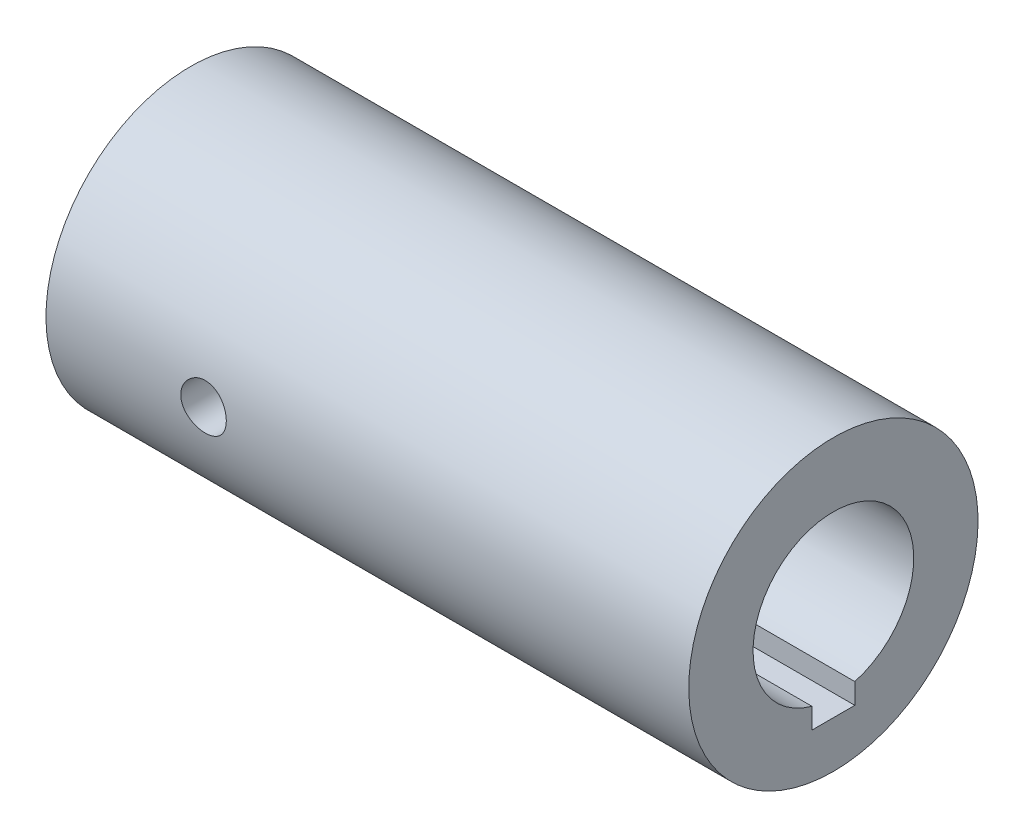
ISO-10303-21;
HEADER;
FILE_DESCRIPTION(('STEP AP214'),'2;1');
FILE_NAME('part.step','',(''),(''),'','','');
FILE_SCHEMA(('AUTOMOTIVE_DESIGN { 1 0 10303 214 1 1 1 1 }'));
ENDSEC;
DATA;
#1=APPLICATION_CONTEXT('core data for automotive mechanical design processes');
#2=APPLICATION_PROTOCOL_DEFINITION('international standard','automotive_design',2000,#1);
#3=PRODUCT_CONTEXT('',#1,'mechanical');
#4=PRODUCT('Part','Part','',(#3));
#5=PRODUCT_RELATED_PRODUCT_CATEGORY('part','',(#4));
#6=PRODUCT_DEFINITION_FORMATION('','',#4);
#7=PRODUCT_DEFINITION_CONTEXT('part definition',#1,'design');
#8=PRODUCT_DEFINITION('design','',#6,#7);
#9=PRODUCT_DEFINITION_SHAPE('','',#8);
#10=(LENGTH_UNIT() NAMED_UNIT(*) SI_UNIT(.MILLI.,.METRE.));
#11=(NAMED_UNIT(*) PLANE_ANGLE_UNIT() SI_UNIT($,.RADIAN.));
#12=(NAMED_UNIT(*) SI_UNIT($,.STERADIAN.) SOLID_ANGLE_UNIT());
#13=UNCERTAINTY_MEASURE_WITH_UNIT(LENGTH_MEASURE(1.E-05),#10,'distance_accuracy_value','');
#14=(GEOMETRIC_REPRESENTATION_CONTEXT(3) GLOBAL_UNCERTAINTY_ASSIGNED_CONTEXT((#13)) GLOBAL_UNIT_ASSIGNED_CONTEXT((#10,
#11,#12)) REPRESENTATION_CONTEXT('',''));
#15=CARTESIAN_POINT('',(0.,0.,0.));
#16=DIRECTION('',(0.,0.,1.));
#17=DIRECTION('',(1.,0.,0.));
#18=AXIS2_PLACEMENT_3D('',#15,#16,#17);
#19=CARTESIAN_POINT('',(-60.,15.,0.));
#20=DIRECTION('',(1.,0.,0.));
#21=DIRECTION('',(0.,1.,0.));
#22=AXIS2_PLACEMENT_3D('',#19,#20,#21);
#23=PLANE('',#22);
#24=DIRECTION('',(0.,0.,1.));
#25=VECTOR('',#24,1.);
#26=CARTESIAN_POINT('',(-60.,-18.3,-4.));
#27=LINE('',#26,#25);
#28=CARTESIAN_POINT('',(-60.,-18.3,-4.));
#29=VERTEX_POINT('',#28);
#30=CARTESIAN_POINT('',(-60.,-18.3,4.));
#31=VERTEX_POINT('',#30);
#32=EDGE_CURVE('E92',#29,#31,#27,.T.);
#33=ORIENTED_EDGE('',*,*,#32,.F.);
#34=DIRECTION('',(0.,1.,0.));
#35=VECTOR('',#34,1.);
#36=CARTESIAN_POINT('',(-60.,-18.3,-4.));
#37=LINE('',#36,#35);
#38=CARTESIAN_POINT('',(-60.,-14.4568322948009,-4.));
#39=VERTEX_POINT('',#38);
#40=EDGE_CURVE('E114',#29,#39,#37,.T.);
#41=ORIENTED_EDGE('',*,*,#40,.T.);
#42=CARTESIAN_POINT('',(-60.,0.,0.));
#43=DIRECTION('',(-1.,0.,0.));
#44=DIRECTION('',(0.,-1.,0.));
#45=AXIS2_PLACEMENT_3D('',#42,#43,#44);
#46=CIRCLE('',#45,15.);
#47=CARTESIAN_POINT('',(-60.,-14.456832294801,4.00000000000001));
#48=VERTEX_POINT('',#47);
#49=EDGE_CURVE('E105',#48,#39,#46,.T.);
#50=ORIENTED_EDGE('',*,*,#49,.F.);
#51=DIRECTION('',(0.,1.,0.));
#52=VECTOR('',#51,1.);
#53=CARTESIAN_POINT('',(-60.,-18.3,4.));
#54=LINE('',#53,#52);
#55=EDGE_CURVE('E62',#31,#48,#54,.T.);
#56=ORIENTED_EDGE('',*,*,#55,.F.);
#57=EDGE_LOOP('',(#33,#41,#50,#56));
#58=FACE_BOUND('',#57,.T.);
#59=CARTESIAN_POINT('',(-60.,0.,0.));
#60=DIRECTION('',(-1.,0.,0.));
#61=DIRECTION('',(0.,-1.,0.));
#62=AXIS2_PLACEMENT_3D('',#59,#60,#61);
#63=CIRCLE('',#62,27.);
#64=CARTESIAN_POINT('',(-60.,-27.,0.));
#65=VERTEX_POINT('',#64);
#66=EDGE_CURVE('E120',#65,#65,#63,.T.);
#67=ORIENTED_EDGE('',*,*,#66,.T.);
#68=EDGE_LOOP('',(#67));
#69=FACE_BOUND('',#68,.T.);
#70=ADVANCED_FACE('F42',(#58,#69),#23,.F.);
#71=CARTESIAN_POINT('',(-60.,0.,0.));
#72=DIRECTION('',(-1.,0.,0.));
#73=DIRECTION('',(0.,-1.,0.));
#74=AXIS2_PLACEMENT_3D('',#71,#72,#73);
#75=CYLINDRICAL_SURFACE('',#74,27.);
#76=CARTESIAN_POINT('',(-26.334904592039,0.,27.));
#77=CARTESIAN_POINT('',(-26.3349142598016,-0.23715285369702,26.9999960750393));
#78=CARTESIAN_POINT('',(-26.3548215566724,-0.474439789620541,26.9968428141752));
#79=CARTESIAN_POINT('',(-26.4338990154312,-0.942371359480702,26.9845673789826));
#80=CARTESIAN_POINT('',(-26.4931064898128,-1.17300946352038,26.9754395323594));
#81=CARTESIAN_POINT('',(-26.6489630863513,-1.62080456875642,26.9522398462363));
#82=CARTESIAN_POINT('',(-26.7455828999265,-1.83797196868977,26.9381718775968));
#83=CARTESIAN_POINT('',(-26.9734476155345,-2.25298112669716,26.9066431258642));
#84=CARTESIAN_POINT('',(-27.1046880769168,-2.45082535881943,26.8891827779735));
#85=CARTESIAN_POINT('',(-27.399265962626,-2.82329811568718,26.8526410138245));
#86=CARTESIAN_POINT('',(-27.5628417065176,-2.99773706212815,26.833548197596));
#87=CARTESIAN_POINT('',(-27.9169339156955,-3.31681106622933,26.7959817461457));
#88=CARTESIAN_POINT('',(-28.1074519930343,-3.4614443392403,26.7775081480556));
#89=CARTESIAN_POINT('',(-28.5113070091752,-3.71754889519365,26.7431612919968));
#90=CARTESIAN_POINT('',(-28.7247627473795,-3.8288349894193,26.7273027674901));
#91=CARTESIAN_POINT('',(-29.1676281743122,-4.01390238565908,26.700138407797));
#92=CARTESIAN_POINT('',(-29.3970369033037,-4.08768594162206,26.6888322990132));
#93=CARTESIAN_POINT('',(-29.8632954093655,-4.19506130753929,26.6721656087048));
#94=CARTESIAN_POINT('',(-30.100068409357,-4.22897889359198,26.666756861936));
#95=CARTESIAN_POINT('',(-30.5760021207348,-4.25666911598487,26.6623513061717));
#96=CARTESIAN_POINT('',(-30.8151626803561,-4.25044428795608,26.6633540921861));
#97=CARTESIAN_POINT('',(-31.2867708711107,-4.19829223282215,26.6716142842267));
#98=CARTESIAN_POINT('',(-31.519259924786,-4.15272918537987,26.6788143164114));
#99=CARTESIAN_POINT('',(-31.9732517073993,-4.0237647660574,26.698568035602));
#100=CARTESIAN_POINT('',(-32.1947540966577,-3.94036222508453,26.7111218880195));
#101=CARTESIAN_POINT('',(-32.621585253802,-3.73771167446049,26.7402315179244));
#102=CARTESIAN_POINT('',(-32.8268401984125,-3.61831071951808,26.7568043105755));
#103=CARTESIAN_POINT('',(-33.2145392801458,-3.34716147317375,26.7920724018515));
#104=CARTESIAN_POINT('',(-33.3969817697544,-3.19541084761888,26.8107678535889));
#105=CARTESIAN_POINT('',(-33.7359866034964,-2.86187725692331,26.8484276561896));
#106=CARTESIAN_POINT('',(-33.8922412509134,-2.67978145918748,26.8673926983003));
#107=CARTESIAN_POINT('',(-34.1720211369645,-2.29178922024805,26.9032636581147));
#108=CARTESIAN_POINT('',(-34.295546204786,-2.08589265483863,26.9201695650719));
#109=CARTESIAN_POINT('',(-34.5063815730427,-1.65586706360369,26.9500377312955));
#110=CARTESIAN_POINT('',(-34.593666647867,-1.43172546730791,26.9629972419227));
#111=CARTESIAN_POINT('',(-34.7292690477105,-0.971715417957423,26.9834898719475));
#112=CARTESIAN_POINT('',(-34.7775892765954,-0.735847840175804,26.9910233957138));
#113=CARTESIAN_POINT('',(-34.8334777587455,-0.261735329887099,26.9997613199618));
#114=CARTESIAN_POINT('',(-34.8414687643796,-0.0235413979410436,27.00103137423));
#115=CARTESIAN_POINT('',(-34.8175962222078,0.450783624065372,26.9972784519158));
#116=CARTESIAN_POINT('',(-34.7857340370719,0.686914784378539,26.9922556904989));
#117=CARTESIAN_POINT('',(-34.6834111507296,1.14911992003457,26.9765221138286));
#118=CARTESIAN_POINT('',(-34.6131578534982,1.3752409407071,26.9658418719435));
#119=CARTESIAN_POINT('',(-34.4362667214058,1.81249513579372,26.9399865580313));
#120=CARTESIAN_POINT('',(-34.3296270305052,2.02362754498749,26.9248112567201));
#121=CARTESIAN_POINT('',(-34.0820086113369,2.42676042454265,26.8914878573971));
#122=CARTESIAN_POINT('',(-33.9407634802608,2.61859535037075,26.8733170724382));
#123=CARTESIAN_POINT('',(-33.6283125865675,2.97598983212627,26.8360919418735));
#124=CARTESIAN_POINT('',(-33.4571048961259,3.14154769605031,26.8170375394727));
#125=CARTESIAN_POINT('',(-33.0877006701551,3.44323920525201,26.7799827559447));
#126=CARTESIAN_POINT('',(-32.8892705800871,3.579088477855,26.7619936697435));
#127=CARTESIAN_POINT('',(-32.4721586989072,3.8155258447596,26.7293110355597));
#128=CARTESIAN_POINT('',(-32.253477497613,3.91611496561222,26.7146173916392));
#129=CARTESIAN_POINT('',(-31.8028960652247,4.07874256663451,26.6902723917565));
#130=CARTESIAN_POINT('',(-31.5710496587843,4.14092718967759,26.6806019433571));
#131=CARTESIAN_POINT('',(-31.1000391152415,4.22544356437585,26.6673487252601));
#132=CARTESIAN_POINT('',(-30.8608755409078,4.24777837311067,26.6637654885829));
#133=CARTESIAN_POINT('',(-30.3848562367991,4.2518829547408,26.6631110134454));
#134=CARTESIAN_POINT('',(-30.148004342645,4.23410005203714,26.6659679646999));
#135=CARTESIAN_POINT('',(-29.6807057232967,4.15943633945809,26.6777153254047));
#136=CARTESIAN_POINT('',(-29.4502589835244,4.10255561857632,26.6866057211217));
#137=CARTESIAN_POINT('',(-29.0024574049637,3.9514748492268,26.7093921936408));
#138=CARTESIAN_POINT('',(-28.7850907072176,3.85730921062861,26.7232836539415));
#139=CARTESIAN_POINT('',(-28.3691684129159,3.63437669339628,26.7545121344657));
#140=CARTESIAN_POINT('',(-28.1706135827802,3.50560840582456,26.7718492949824));
#141=CARTESIAN_POINT('',(-27.7956839329803,3.21551297067001,26.8082452229805));
#142=CARTESIAN_POINT('',(-27.6195662903674,3.05385543965607,26.8273202791406));
#143=CARTESIAN_POINT('',(-27.2968018241968,2.70326839005845,26.8649093745033));
#144=CARTESIAN_POINT('',(-27.1501618364002,2.51433256315032,26.8834232827344));
#145=CARTESIAN_POINT('',(-26.8897077089817,2.11318978067825,26.9179339308913));
#146=CARTESIAN_POINT('',(-26.7760992187004,1.90084792867176,26.9339146307385));
#147=CARTESIAN_POINT('',(-26.5863340653057,1.45993795209869,26.9614016655895));
#148=CARTESIAN_POINT('',(-26.5101392537259,1.23138662870349,26.9729125556715));
#149=CARTESIAN_POINT('',(-26.4143285953811,0.83488990996912,26.9875851726316));
#150=CARTESIAN_POINT('',(-26.3845910461336,0.669371629205708,26.9922164045916));
#151=CARTESIAN_POINT('',(-26.3448757623741,0.335924637167469,26.9984251865002));
#152=CARTESIAN_POINT('',(-26.3348977435232,0.167995960613158,27.0000027803905));
#153=CARTESIAN_POINT('',(-26.334904592039,0.,27.));
#154=B_SPLINE_CURVE_WITH_KNOTS('',3,(#76,#77,#78,#79,#80,#81,#82,#83,#84,#85,#86,#87,#88,#89,
#90,#91,#92,#93,#94,#95,#96,#97,#98,#99,#100,#101,#102,#103,#104,#105,#106,#107,#108,#109,#110,
#111,#112,#113,#114,#115,#116,#117,#118,#119,#120,#121,#122,#123,#124,#125,#126,#127,#128,#129,
#130,#131,#132,#133,#134,#135,#136,#137,#138,#139,#140,#141,#142,#143,#144,#145,#146,#147,#148,
#149,#150,#151,#152,#153),.UNSPECIFIED.,.T.,.F.,(4,2,2,2,2,2,2,2,2,2,2,2,2,2,2,2,2,2,2,2,2,2,2,
2,2,2,2,2,2,2,2,2,2,2,2,2,2,2,4),(0.,0.710844600992774,1.42236506140228,2.13332924538739,
2.8442022811761,3.56052432449003,4.27688924596268,4.99716165361728,5.71739076689074,
6.43169247581055,7.14594906567473,7.85366336314914,8.56139952772264,9.27218604756005,
9.98302387074335,10.7017032475745,11.4203863750489,12.1395689217592,12.8586978662406,
13.5702726281843,14.2818230604551,14.9895668817659,15.6973468098948,16.4107567834997,
17.1242126755869,17.8442248259273,18.5642160123589,19.281450214723,19.9986293920788,
20.7078513819534,21.4170717575175,22.1256391207645,22.8342353395621,23.550336215186,
24.266602960921,24.9872380066255,25.7071367305728,26.2106969374206,26.7142498980062),.UNSPECIFIED.);
#155=CARTESIAN_POINT('',(-26.334904592039,0.,27.));
#156=VERTEX_POINT('',#155);
#157=EDGE_CURVE('E45',#156,#156,#154,.T.);
#158=ORIENTED_EDGE('',*,*,#157,.T.);
#159=EDGE_LOOP('',(#158));
#160=FACE_BOUND('',#159,.T.);
#161=CARTESIAN_POINT('',(-34.834904592039,0.,-27.));
#162=CARTESIAN_POINT('',(-34.8348949242763,-0.23715285369702,-26.9999960750393));
#163=CARTESIAN_POINT('',(-34.8149876274055,-0.47443978962054,-26.9968428141752));
#164=CARTESIAN_POINT('',(-34.7359101686468,-0.942371359480703,-26.9845673789826));
#165=CARTESIAN_POINT('',(-34.6767026942651,-1.17300946352038,-26.9754395323594));
#166=CARTESIAN_POINT('',(-34.5208460977266,-1.62080456875642,-26.9522398462363));
#167=CARTESIAN_POINT('',(-34.4242262841515,-1.83797196868978,-26.9381718775968));
#168=CARTESIAN_POINT('',(-34.1963615685435,-2.25298112669717,-26.9066431258642));
#169=CARTESIAN_POINT('',(-34.0651211071611,-2.45082535881944,-26.8891827779735));
#170=CARTESIAN_POINT('',(-33.7705432214519,-2.82329811568718,-26.8526410138245));
#171=CARTESIAN_POINT('',(-33.6069674775603,-2.99773706212815,-26.833548197596));
#172=CARTESIAN_POINT('',(-33.2528752683824,-3.31681106622933,-26.7959817461457));
#173=CARTESIAN_POINT('',(-33.0623571910436,-3.4614443392403,-26.7775081480556));
#174=CARTESIAN_POINT('',(-32.6585021749027,-3.71754889519365,-26.7431612919968));
#175=CARTESIAN_POINT('',(-32.4450464366984,-3.82883498941931,-26.7273027674901));
#176=CARTESIAN_POINT('',(-32.0021810097658,-4.01390238565909,-26.700138407797));
#177=CARTESIAN_POINT('',(-31.7727722807742,-4.08768594162206,-26.6888322990132));
#178=CARTESIAN_POINT('',(-31.3065137747124,-4.19506130753929,-26.6721656087048));
#179=CARTESIAN_POINT('',(-31.069740774721,-4.22897889359198,-26.666756861936));
#180=CARTESIAN_POINT('',(-30.5938070633431,-4.25666911598487,-26.6623513061717));
#181=CARTESIAN_POINT('',(-30.3546465037218,-4.25044428795608,-26.6633540921861));
#182=CARTESIAN_POINT('',(-29.8830383129672,-4.19829223282215,-26.6716142842267));
#183=CARTESIAN_POINT('',(-29.6505492592919,-4.15272918537987,-26.6788143164114));
#184=CARTESIAN_POINT('',(-29.1965574766786,-4.0237647660574,-26.698568035602));
#185=CARTESIAN_POINT('',(-28.9750550874202,-3.94036222508453,-26.7111218880195));
#186=CARTESIAN_POINT('',(-28.548223930276,-3.73771167446049,-26.7402315179244));
#187=CARTESIAN_POINT('',(-28.3429689856654,-3.61831071951808,-26.7568043105755));
#188=CARTESIAN_POINT('',(-27.9552699039322,-3.34716147317375,-26.7920724018515));
#189=CARTESIAN_POINT('',(-27.7728274143236,-3.19541084761888,-26.8107678535889));
#190=CARTESIAN_POINT('',(-27.4338225805815,-2.86187725692331,-26.8484276561896));
#191=CARTESIAN_POINT('',(-27.2775679331645,-2.67978145918748,-26.8673926983003));
#192=CARTESIAN_POINT('',(-26.9977880471135,-2.29178922024805,-26.9032636581147));
#193=CARTESIAN_POINT('',(-26.8742629792919,-2.08589265483863,-26.9201695650719));
#194=CARTESIAN_POINT('',(-26.6634276110352,-1.65586706360369,-26.9500377312955));
#195=CARTESIAN_POINT('',(-26.5761425362109,-1.43172546730791,-26.9629972419227));
#196=CARTESIAN_POINT('',(-26.4405401363674,-0.971715417957421,-26.9834898719475));
#197=CARTESIAN_POINT('',(-26.3922199074825,-0.735847840175801,-26.9910233957138));
#198=CARTESIAN_POINT('',(-26.3363314253324,-0.261735329887095,-26.9997613199618));
#199=CARTESIAN_POINT('',(-26.3283404196983,-0.0235413979410395,-27.00103137423));
#200=CARTESIAN_POINT('',(-26.3522129618701,0.450783624065377,-26.9972784519158));
#201=CARTESIAN_POINT('',(-26.384075147006,0.686914784378544,-26.9922556904989));
#202=CARTESIAN_POINT('',(-26.4863980333483,1.14911992003457,-26.9765221138286));
#203=CARTESIAN_POINT('',(-26.5566513305797,1.3752409407071,-26.9658418719435));
#204=CARTESIAN_POINT('',(-26.7335424626722,1.81249513579373,-26.9399865580313));
#205=CARTESIAN_POINT('',(-26.8401821535727,2.02362754498749,-26.9248112567201));
#206=CARTESIAN_POINT('',(-27.087800572741,2.42676042454265,-26.8914878573971));
#207=CARTESIAN_POINT('',(-27.2290457038172,2.61859535037076,-26.8733170724382));
#208=CARTESIAN_POINT('',(-27.5414965975104,2.97598983212628,-26.8360919418735));
#209=CARTESIAN_POINT('',(-27.712704287952,3.14154769605032,-26.8170375394727));
#210=CARTESIAN_POINT('',(-28.0821085139229,3.44323920525202,-26.7799827559447));
#211=CARTESIAN_POINT('',(-28.2805386039909,3.57908847785501,-26.7619936697435));
#212=CARTESIAN_POINT('',(-28.6976504851708,3.8155258447596,-26.7293110355597));
#213=CARTESIAN_POINT('',(-28.916331686465,3.91611496561223,-26.7146173916392));
#214=CARTESIAN_POINT('',(-29.3669131188533,4.07874256663451,-26.6902723917565));
#215=CARTESIAN_POINT('',(-29.5987595252937,4.14092718967759,-26.6806019433571));
#216=CARTESIAN_POINT('',(-30.0697700688364,4.22544356437585,-26.6673487252601));
#217=CARTESIAN_POINT('',(-30.3089336431702,4.24777837311067,-26.6637654885829));
#218=CARTESIAN_POINT('',(-30.7849529472788,4.2518829547408,-26.6631110134454));
#219=CARTESIAN_POINT('',(-31.0218048414329,4.23410005203714,-26.6659679646999));
#220=CARTESIAN_POINT('',(-31.4891034607813,4.15943633945809,-26.6777153254047));
#221=CARTESIAN_POINT('',(-31.7195502005535,4.10255561857632,-26.6866057211217));
#222=CARTESIAN_POINT('',(-32.1673517791142,3.95147484922679,-26.7093921936408));
#223=CARTESIAN_POINT('',(-32.3847184768603,3.85730921062861,-26.7232836539415));
#224=CARTESIAN_POINT('',(-32.8006407711621,3.63437669339628,-26.7545121344657));
#225=CARTESIAN_POINT('',(-32.9991956012978,3.50560840582455,-26.7718492949824));
#226=CARTESIAN_POINT('',(-33.3741252510976,3.21551297067,-26.8082452229805));
#227=CARTESIAN_POINT('',(-33.5502428937105,3.05385543965606,-26.8273202791406));
#228=CARTESIAN_POINT('',(-33.8730073598812,2.70326839005844,-26.8649093745033));
#229=CARTESIAN_POINT('',(-34.0196473476778,2.51433256315031,-26.8834232827344));
#230=CARTESIAN_POINT('',(-34.2801014750962,2.11318978067824,-26.9179339308913));
#231=CARTESIAN_POINT('',(-34.3937099653776,1.90084792867176,-26.9339146307385));
#232=CARTESIAN_POINT('',(-34.5834751187723,1.45993795209869,-26.9614016655895));
#233=CARTESIAN_POINT('',(-34.6596699303521,1.23138662870349,-26.9729125556715));
#234=CARTESIAN_POINT('',(-34.7554805886969,0.834889909969122,-26.9875851726316));
#235=CARTESIAN_POINT('',(-34.7852181379443,0.669371629205709,-26.9922164045916));
#236=CARTESIAN_POINT('',(-34.8249334217039,0.335924637167469,-26.9984251865002));
#237=CARTESIAN_POINT('',(-34.8349114405548,0.167995960613158,-27.0000027803905));
#238=CARTESIAN_POINT('',(-34.834904592039,0.,-27.));
#239=B_SPLINE_CURVE_WITH_KNOTS('',3,(#161,#162,#163,#164,#165,#166,#167,#168,#169,#170,#171,
#172,#173,#174,#175,#176,#177,#178,#179,#180,#181,#182,#183,#184,#185,#186,#187,#188,#189,#190,
#191,#192,#193,#194,#195,#196,#197,#198,#199,#200,#201,#202,#203,#204,#205,#206,#207,#208,#209,
#210,#211,#212,#213,#214,#215,#216,#217,#218,#219,#220,#221,#222,#223,#224,#225,#226,#227,#228,
#229,#230,#231,#232,#233,#234,#235,#236,#237,#238),.UNSPECIFIED.,.T.,.F.,(4,2,2,2,2,2,2,2,2,2,2,
2,2,2,2,2,2,2,2,2,2,2,2,2,2,2,2,2,2,2,2,2,2,2,2,2,2,2,4),(0.,0.710844600992774,1.42236506140228,
2.1333292453874,2.84420228117611,3.56052432449003,4.27688924596268,4.99716165361729,
5.71739076689074,6.43169247581055,7.14594906567473,7.85366336314915,8.56139952772264,
9.27218604756005,9.98302387074335,10.7017032475745,11.4203863750489,12.1395689217592,
12.8586978662406,13.5702726281843,14.2818230604551,14.9895668817659,15.6973468098948,
16.4107567834997,17.1242126755869,17.8442248259273,18.5642160123589,19.281450214723,
19.9986293920788,20.7078513819534,21.4170717575175,22.1256391207645,22.8342353395621,
23.550336215186,24.266602960921,24.9872380066255,25.7071367305728,26.2106969374205,
26.7142498980061),.UNSPECIFIED.);
#240=CARTESIAN_POINT('',(-34.834904592039,0.,-27.));
#241=VERTEX_POINT('',#240);
#242=EDGE_CURVE('E123',#241,#241,#239,.T.);
#243=ORIENTED_EDGE('',*,*,#242,.T.);
#244=EDGE_LOOP('',(#243));
#245=FACE_BOUND('',#244,.T.);
#246=ORIENTED_EDGE('',*,*,#66,.F.);
#247=EDGE_LOOP('',(#246));
#248=FACE_BOUND('',#247,.T.);
#249=CARTESIAN_POINT('',(60.,0.,0.));
#250=DIRECTION('',(-1.,0.,0.));
#251=DIRECTION('',(0.,-1.,0.));
#252=AXIS2_PLACEMENT_3D('',#249,#250,#251);
#253=CIRCLE('',#252,27.);
#254=CARTESIAN_POINT('',(60.,-27.,0.));
#255=VERTEX_POINT('',#254);
#256=EDGE_CURVE('E117',#255,#255,#253,.T.);
#257=ORIENTED_EDGE('',*,*,#256,.T.);
#258=EDGE_LOOP('',(#257));
#259=FACE_BOUND('',#258,.T.);
#260=ADVANCED_FACE('F130',(#160,#245,#248,#259),#75,.T.);
#261=CARTESIAN_POINT('',(60.,15.,0.));
#262=DIRECTION('',(-1.,0.,0.));
#263=DIRECTION('',(0.,-1.,0.));
#264=AXIS2_PLACEMENT_3D('',#261,#262,#263);
#265=PLANE('',#264);
#266=CARTESIAN_POINT('',(60.,0.,0.));
#267=DIRECTION('',(-1.,0.,0.));
#268=DIRECTION('',(0.,-1.,0.));
#269=AXIS2_PLACEMENT_3D('',#266,#267,#268);
#270=CIRCLE('',#269,15.);
#271=CARTESIAN_POINT('',(60.,-14.4568322948009,4.));
#272=VERTEX_POINT('',#271);
#273=CARTESIAN_POINT('',(60.,-14.4568322948009,-4.));
#274=VERTEX_POINT('',#273);
#275=EDGE_CURVE('E113',#272,#274,#270,.T.);
#276=ORIENTED_EDGE('',*,*,#275,.T.);
#277=DIRECTION('',(0.,1.,0.));
#278=VECTOR('',#277,1.);
#279=CARTESIAN_POINT('',(60.,-18.3,-4.));
#280=LINE('',#279,#278);
#281=CARTESIAN_POINT('',(60.,-18.3,-4.));
#282=VERTEX_POINT('',#281);
#283=EDGE_CURVE('E107',#282,#274,#280,.T.);
#284=ORIENTED_EDGE('',*,*,#283,.F.);
#285=DIRECTION('',(0.,0.,-1.));
#286=VECTOR('',#285,1.);
#287=CARTESIAN_POINT('',(60.,-18.3,-4.));
#288=LINE('',#287,#286);
#289=CARTESIAN_POINT('',(60.,-18.3,4.));
#290=VERTEX_POINT('',#289);
#291=EDGE_CURVE('E91',#290,#282,#288,.T.);
#292=ORIENTED_EDGE('',*,*,#291,.F.);
#293=DIRECTION('',(0.,1.,0.));
#294=VECTOR('',#293,1.);
#295=CARTESIAN_POINT('',(60.,-18.3,4.));
#296=LINE('',#295,#294);
#297=EDGE_CURVE('E88',#290,#272,#296,.T.);
#298=ORIENTED_EDGE('',*,*,#297,.T.);
#299=EDGE_LOOP('',(#276,#284,#292,#298));
#300=FACE_BOUND('',#299,.T.);
#301=ORIENTED_EDGE('',*,*,#256,.F.);
#302=EDGE_LOOP('',(#301));
#303=FACE_BOUND('',#302,.T.);
#304=ADVANCED_FACE('F157',(#300,#303),#265,.F.);
#305=CARTESIAN_POINT('',(-60.,0.,0.));
#306=DIRECTION('',(-1.,0.,0.));
#307=DIRECTION('',(0.,-1.,0.));
#308=AXIS2_PLACEMENT_3D('',#305,#306,#307);
#309=CYLINDRICAL_SURFACE('',#308,15.);
#310=CARTESIAN_POINT('',(-26.334904592039,0.,15.));
#311=CARTESIAN_POINT('',(-26.3349089105976,0.233735903758502,14.9999971118743));
#312=CARTESIAN_POINT('',(-26.3542509738825,0.467516411306013,14.9944837238696));
#313=CARTESIAN_POINT('',(-26.4309486637448,0.928306924754671,14.9730266378638));
#314=CARTESIAN_POINT('',(-26.488319174368,1.1553142433122,14.9570788559517));
#315=CARTESIAN_POINT('',(-26.6390318563624,1.59584313791903,14.9165070194676));
#316=CARTESIAN_POINT('',(-26.7323243542597,1.80938286468957,14.8918949500168));
#317=CARTESIAN_POINT('',(-26.9520390057754,2.21778745952664,14.8365745564153));
#318=CARTESIAN_POINT('',(-27.0784644682087,2.41265045979084,14.8058656234773));
#319=CARTESIAN_POINT('',(-27.3643095994424,2.78321592605813,14.7407584329945));
#320=CARTESIAN_POINT('',(-27.5244294643142,2.95836609347456,14.7062908802446));
#321=CARTESIAN_POINT('',(-27.8716236564388,3.27972182868294,14.637980436295));
#322=CARTESIAN_POINT('',(-28.05870194164,3.42592313880101,14.6041376376442));
#323=CARTESIAN_POINT('',(-28.4590392470934,3.68802684892063,14.5401881358751));
#324=CARTESIAN_POINT('',(-28.6727416915948,3.80327510921261,14.5101682398622));
#325=CARTESIAN_POINT('',(-29.1174801803458,3.99598059970348,14.4582906499781));
#326=CARTESIAN_POINT('',(-29.3485125531837,4.07344580844342,14.4364312331104));
#327=CARTESIAN_POINT('',(-29.815193096872,4.18643230680051,14.4040683122725));
#328=CARTESIAN_POINT('',(-30.0505773990431,4.22296334331976,14.3932919942674));
#329=CARTESIAN_POINT('',(-30.5243613627009,4.2561951757382,14.3835019688808));
#330=CARTESIAN_POINT('',(-30.7627603701498,4.2529044677125,14.3844857524497));
#331=CARTESIAN_POINT('',(-31.2277678949478,4.20738368353363,14.3978617524435));
#332=CARTESIAN_POINT('',(-31.4545102026951,4.16639600206302,14.4098899528946));
#333=CARTESIAN_POINT('',(-31.8977592321753,4.04864308830224,14.443413720268));
#334=CARTESIAN_POINT('',(-32.1142650404495,3.97187466971385,14.4649101303312));
#335=CARTESIAN_POINT('',(-32.5340361411739,3.78377500309743,14.5152537463671));
#336=CARTESIAN_POINT('',(-32.7371023760967,3.67202420129429,14.5441893769251));
#337=CARTESIAN_POINT('',(-33.1220269639723,3.41742404841451,14.606106050526));
#338=CARTESIAN_POINT('',(-33.3038806512433,3.27456787547111,14.6390879802882));
#339=CARTESIAN_POINT('',(-33.6482919527346,2.95554811005476,14.7068774273018));
#340=CARTESIAN_POINT('',(-33.8098856533624,2.77834701842198,14.7417073201993));
#341=CARTESIAN_POINT('',(-34.1012737976781,2.3989299278313,14.8081793703168));
#342=CARTESIAN_POINT('',(-34.2310666473373,2.19671267569396,14.8398213676957));
#343=CARTESIAN_POINT('',(-34.4556701313933,1.77138523397801,14.896590649469));
#344=CARTESIAN_POINT('',(-34.5502872416874,1.54816768977323,14.9216816743041));
#345=CARTESIAN_POINT('',(-34.7003637884688,1.08811664157791,14.9622605853331));
#346=CARTESIAN_POINT('',(-34.7558329251045,0.851286526271832,14.9777508503029));
#347=CARTESIAN_POINT('',(-34.8244812642909,0.378943696946973,14.9970150902131));
#348=CARTESIAN_POINT('',(-34.8389688966034,0.143635634490966,15.0011514333043));
#349=CARTESIAN_POINT('',(-34.828882603143,-0.326054943364068,14.9982939482367));
#350=CARTESIAN_POINT('',(-34.8043132798899,-0.560437564555484,14.9913014315165));
#351=CARTESIAN_POINT('',(-34.7178769022712,-1.01682344329249,14.9672076487748));
#352=CARTESIAN_POINT('',(-34.6567565580103,-1.23897980984215,14.9503088927647));
#353=CARTESIAN_POINT('',(-34.4998354023541,-1.66985172335221,14.9083364068582));
#354=CARTESIAN_POINT('',(-34.404030609324,-1.8785657239418,14.8832617384328));
#355=CARTESIAN_POINT('',(-34.17814640982,-2.28158177425507,14.826891290685));
#356=CARTESIAN_POINT('',(-34.0473775641253,-2.47547995146874,14.79547389055));
#357=CARTESIAN_POINT('',(-33.7561295323003,-2.83903338637667,14.7300396191885));
#358=CARTESIAN_POINT('',(-33.5956437009559,-3.00868320666891,14.6960221675481));
#359=CARTESIAN_POINT('',(-33.2433869369712,-3.32456107574155,14.6278596672057));
#360=CARTESIAN_POINT('',(-33.0507765683565,-3.46986157633098,14.5937456285391));
#361=CARTESIAN_POINT('',(-32.6431725577956,-3.72612048210724,14.5304340548377));
#362=CARTESIAN_POINT('',(-32.4281797202205,-3.83708012085165,14.5012363432208));
#363=CARTESIAN_POINT('',(-31.9828335935978,-4.02069295537116,14.4514043291436));
#364=CARTESIAN_POINT('',(-31.7525707352427,-4.09355231762717,14.4307240695142));
#365=CARTESIAN_POINT('',(-31.2823632864386,-4.19929456159121,14.4003128629765));
#366=CARTESIAN_POINT('',(-31.0424215908722,-4.23218930621465,14.3905786669523));
#367=CARTESIAN_POINT('',(-30.569229555111,-4.25632379292053,14.3834573170053));
#368=CARTESIAN_POINT('',(-30.3360613760182,-4.24906419600604,14.3856253268564));
#369=CARTESIAN_POINT('',(-29.8744188610315,-4.19662630102083,14.4010089333252));
#370=CARTESIAN_POINT('',(-29.6459443735901,-4.15144922918745,14.4142241726793));
#371=CARTESIAN_POINT('',(-29.2023371144906,-4.02537863704035,14.4499315838925));
#372=CARTESIAN_POINT('',(-28.9870949990678,-3.94484170053666,14.4723309932438));
#373=CARTESIAN_POINT('',(-28.5730088579159,-3.7506132866242,14.5238751821933));
#374=CARTESIAN_POINT('',(-28.3741677016798,-3.63691602323986,14.5530211387785));
#375=CARTESIAN_POINT('',(-27.9914607937505,-3.37520947877457,14.6159711575891));
#376=CARTESIAN_POINT('',(-27.8083025008836,-3.22619483896407,14.649896878713));
#377=CARTESIAN_POINT('',(-27.4691044032441,-2.89994549393589,14.7179495625547));
#378=CARTESIAN_POINT('',(-27.3130714054481,-2.72270372656126,14.7520765735701));
#379=CARTESIAN_POINT('',(-27.0286770111493,-2.33966929175797,14.8177120621263));
#380=CARTESIAN_POINT('',(-26.9011081335425,-2.13327184941117,14.8491333556775));
#381=CARTESIAN_POINT('',(-26.6826730356117,-1.7010702096589,14.9048213589026));
#382=CARTESIAN_POINT('',(-26.5917863009306,-1.47527694523231,14.9290920654601));
#383=CARTESIAN_POINT('',(-26.4593698855994,-1.04237100834652,14.9650951924588));
#384=CARTESIAN_POINT('',(-26.4128123178352,-0.836887756992193,14.9780830337421));
#385=CARTESIAN_POINT('',(-26.3505797163036,-0.420947965371014,14.9955361888554));
#386=CARTESIAN_POINT('',(-26.3349007029388,-0.210492069512138,15.0000026009164));
#387=CARTESIAN_POINT('',(-26.334904592039,0.,15.));
#388=B_SPLINE_CURVE_WITH_KNOTS('',3,(#310,#311,#312,#313,#314,#315,#316,#317,#318,#319,#320,
#321,#322,#323,#324,#325,#326,#327,#328,#329,#330,#331,#332,#333,#334,#335,#336,#337,#338,#339,
#340,#341,#342,#343,#344,#345,#346,#347,#348,#349,#350,#351,#352,#353,#354,#355,#356,#357,#358,
#359,#360,#361,#362,#363,#364,#365,#366,#367,#368,#369,#370,#371,#372,#373,#374,#375,#376,#377,
#378,#379,#380,#381,#382,#383,#384,#385,#386,#387),.UNSPECIFIED.,.T.,.F.,(4,2,2,2,2,2,2,2,2,2,2,
2,2,2,2,2,2,2,2,2,2,2,2,2,2,2,2,2,2,2,2,2,2,2,2,2,2,2,4),(0.,0.700435177756152,1.40114466252869,
2.10088865525112,2.80070255437281,3.51682382624258,4.23305034405468,4.9633966915684,
5.69358874704828,6.40534245751004,7.11694431610235,7.80590278350416,8.49492261483684,
9.19254492512223,9.89032038865505,10.613934870117,11.3375856155885,12.0651606888393,
12.7925554190042,13.4964489984299,14.2002596363149,14.8901608856646,15.5801413580196,
16.2848836911468,16.9897838071603,17.7173297125852,18.4448494808106,19.1683906916762,
19.8917170773427,20.5881981475602,21.2846566947008,21.974247636784,22.6639589741166,
23.376350514924,24.0889205700846,24.8193692966279,25.5494089544089,26.1802707640797,
26.8110512635845),.UNSPECIFIED.);
#389=CARTESIAN_POINT('',(-26.334904592039,0.,15.));
#390=VERTEX_POINT('',#389);
#391=EDGE_CURVE('E129',#390,#390,#388,.T.);
#392=ORIENTED_EDGE('',*,*,#391,.T.);
#393=EDGE_LOOP('',(#392));
#394=FACE_BOUND('',#393,.T.);
#395=CARTESIAN_POINT('',(-34.834904592039,0.,-15.));
#396=CARTESIAN_POINT('',(-34.8349002734804,0.233735903758503,-14.9999971118743));
#397=CARTESIAN_POINT('',(-34.8155582101954,0.467516411306014,-14.9944837238696));
#398=CARTESIAN_POINT('',(-34.7388605203331,0.928306924754673,-14.9730266378638));
#399=CARTESIAN_POINT('',(-34.6814900097099,1.1553142433122,-14.9570788559517));
#400=CARTESIAN_POINT('',(-34.5307773277156,1.59584313791903,-14.9165070194676));
#401=CARTESIAN_POINT('',(-34.4374848298182,1.80938286468957,-14.8918949500168));
#402=CARTESIAN_POINT('',(-34.2177701783026,2.21778745952664,-14.8365745564153));
#403=CARTESIAN_POINT('',(-34.0913447158693,2.41265045979084,-14.8058656234773));
#404=CARTESIAN_POINT('',(-33.8054995846356,2.78321592605813,-14.7407584329945));
#405=CARTESIAN_POINT('',(-33.6453797197637,2.95836609347456,-14.7062908802446));
#406=CARTESIAN_POINT('',(-33.2981855276391,3.27972182868294,-14.637980436295));
#407=CARTESIAN_POINT('',(-33.1111072424379,3.42592313880101,-14.6041376376442));
#408=CARTESIAN_POINT('',(-32.7107699369845,3.68802684892063,-14.5401881358751));
#409=CARTESIAN_POINT('',(-32.4970674924831,3.80327510921261,-14.5101682398622));
#410=CARTESIAN_POINT('',(-32.0523290037322,3.99598059970348,-14.4582906499781));
#411=CARTESIAN_POINT('',(-31.8212966308943,4.07344580844342,-14.4364312331104));
#412=CARTESIAN_POINT('',(-31.354616087206,4.18643230680051,-14.4040683122725));
#413=CARTESIAN_POINT('',(-31.1192317850348,4.22296334331976,-14.3932919942674));
#414=CARTESIAN_POINT('',(-30.645447821377,4.2561951757382,-14.3835019688808));
#415=CARTESIAN_POINT('',(-30.4070488139281,4.2529044677125,-14.3844857524497));
#416=CARTESIAN_POINT('',(-29.9420412891301,4.20738368353363,-14.3978617524435));
#417=CARTESIAN_POINT('',(-29.7152989813828,4.16639600206302,-14.4098899528946));
#418=CARTESIAN_POINT('',(-29.2720499519027,4.04864308830223,-14.443413720268));
#419=CARTESIAN_POINT('',(-29.0555441436285,3.97187466971384,-14.4649101303312));
#420=CARTESIAN_POINT('',(-28.635773042904,3.78377500309743,-14.5152537463671));
#421=CARTESIAN_POINT('',(-28.4327068079812,3.67202420129429,-14.5441893769251));
#422=CARTESIAN_POINT('',(-28.0477822201057,3.41742404841451,-14.6061060505261));
#423=CARTESIAN_POINT('',(-27.8659285328346,3.27456787547111,-14.6390879802883));
#424=CARTESIAN_POINT('',(-27.5215172313433,2.95554811005475,-14.7068774273018));
#425=CARTESIAN_POINT('',(-27.3599235307155,2.77834701842198,-14.7417073201993));
#426=CARTESIAN_POINT('',(-27.0685353863998,2.3989299278313,-14.8081793703168));
#427=CARTESIAN_POINT('',(-26.9387425367406,2.19671267569395,-14.8398213676957));
#428=CARTESIAN_POINT('',(-26.7141390526846,1.77138523397801,-14.896590649469));
#429=CARTESIAN_POINT('',(-26.6195219423905,1.54816768977322,-14.9216816743041));
#430=CARTESIAN_POINT('',(-26.4694453956091,1.0881166415779,-14.9622605853331));
#431=CARTESIAN_POINT('',(-26.4139762589734,0.85128652627183,-14.9777508503029));
#432=CARTESIAN_POINT('',(-26.3453279197871,0.378943696946971,-14.9970150902131));
#433=CARTESIAN_POINT('',(-26.3308402874745,0.143635634490964,-15.0011514333043));
#434=CARTESIAN_POINT('',(-26.340926580935,-0.326054943364069,-14.9982939482367));
#435=CARTESIAN_POINT('',(-26.365495904188,-0.560437564555486,-14.9913014315165));
#436=CARTESIAN_POINT('',(-26.4519322818068,-1.0168234432925,-14.9672076487748));
#437=CARTESIAN_POINT('',(-26.5130526260677,-1.23897980984216,-14.9503088927647));
#438=CARTESIAN_POINT('',(-26.6699737817239,-1.66985172335222,-14.9083364068582));
#439=CARTESIAN_POINT('',(-26.7657785747539,-1.8785657239418,-14.8832617384328));
#440=CARTESIAN_POINT('',(-26.991662774258,-2.28158177425507,-14.826891290685));
#441=CARTESIAN_POINT('',(-27.1224316199527,-2.47547995146874,-14.79547389055));
#442=CARTESIAN_POINT('',(-27.4136796517776,-2.83903338637667,-14.7300396191885));
#443=CARTESIAN_POINT('',(-27.574165483122,-3.00868320666891,-14.6960221675481));
#444=CARTESIAN_POINT('',(-27.9264222471067,-3.32456107574155,-14.6278596672057));
#445=CARTESIAN_POINT('',(-28.1190326157214,-3.46986157633098,-14.5937456285391));
#446=CARTESIAN_POINT('',(-28.5266366262824,-3.72612048210724,-14.5304340548377));
#447=CARTESIAN_POINT('',(-28.7416294638574,-3.83708012085165,-14.5012363432208));
#448=CARTESIAN_POINT('',(-29.1869755904801,-4.02069295537116,-14.4514043291436));
#449=CARTESIAN_POINT('',(-29.4172384488352,-4.09355231762717,-14.4307240695142));
#450=CARTESIAN_POINT('',(-29.8874458976394,-4.19929456159121,-14.4003128629765));
#451=CARTESIAN_POINT('',(-30.1273875932057,-4.23218930621465,-14.3905786669523));
#452=CARTESIAN_POINT('',(-30.600579628967,-4.25632379292053,-14.3834573170053));
#453=CARTESIAN_POINT('',(-30.8337478080598,-4.24906419600604,-14.3856253268564));
#454=CARTESIAN_POINT('',(-31.2953903230464,-4.19662630102083,-14.4010089333252));
#455=CARTESIAN_POINT('',(-31.5238648104878,-4.15144922918745,-14.4142241726793));
#456=CARTESIAN_POINT('',(-31.9674720695873,-4.02537863704035,-14.4499315838925));
#457=CARTESIAN_POINT('',(-32.1827141850101,-3.94484170053665,-14.4723309932438));
#458=CARTESIAN_POINT('',(-32.596800326162,-3.7506132866242,-14.5238751821933));
#459=CARTESIAN_POINT('',(-32.7956414823982,-3.63691602323986,-14.5530211387785));
#460=CARTESIAN_POINT('',(-33.1783483903275,-3.37520947877456,-14.6159711575891));
#461=CARTESIAN_POINT('',(-33.3615066831943,-3.22619483896407,-14.649896878713));
#462=CARTESIAN_POINT('',(-33.7007047808338,-2.89994549393588,-14.7179495625547));
#463=CARTESIAN_POINT('',(-33.8567377786299,-2.72270372656126,-14.7520765735702));
#464=CARTESIAN_POINT('',(-34.1411321729286,-2.33966929175797,-14.8177120621263));
#465=CARTESIAN_POINT('',(-34.2687010505354,-2.13327184941117,-14.8491333556775));
#466=CARTESIAN_POINT('',(-34.4871361484662,-1.7010702096589,-14.9048213589026));
#467=CARTESIAN_POINT('',(-34.5780228831474,-1.47527694523231,-14.9290920654601));
#468=CARTESIAN_POINT('',(-34.7104392984786,-1.04237100834652,-14.9650951924588));
#469=CARTESIAN_POINT('',(-34.7569968662428,-0.836887756992193,-14.9780830337421));
#470=CARTESIAN_POINT('',(-34.8192294677743,-0.420947965371014,-14.9955361888554));
#471=CARTESIAN_POINT('',(-34.8349084811391,-0.210492069512138,-15.0000026009164));
#472=CARTESIAN_POINT('',(-34.834904592039,0.,-15.));
#473=B_SPLINE_CURVE_WITH_KNOTS('',3,(#395,#396,#397,#398,#399,#400,#401,#402,#403,#404,#405,
#406,#407,#408,#409,#410,#411,#412,#413,#414,#415,#416,#417,#418,#419,#420,#421,#422,#423,#424,
#425,#426,#427,#428,#429,#430,#431,#432,#433,#434,#435,#436,#437,#438,#439,#440,#441,#442,#443,
#444,#445,#446,#447,#448,#449,#450,#451,#452,#453,#454,#455,#456,#457,#458,#459,#460,#461,#462,
#463,#464,#465,#466,#467,#468,#469,#470,#471,#472),.UNSPECIFIED.,.T.,.F.,(4,2,2,2,2,2,2,2,2,2,2,
2,2,2,2,2,2,2,2,2,2,2,2,2,2,2,2,2,2,2,2,2,2,2,2,2,2,2,4),(0.,0.700435177756154,1.40114466252869,
2.10088865525112,2.80070255437281,3.51682382624258,4.23305034405468,4.96339669156839,
5.69358874704829,6.40534245751004,7.11694431610235,7.80590278350417,8.49492261483684,
9.19254492512223,9.89032038865505,10.613934870117,11.3375856155885,12.0651606888393,
12.7925554190042,13.4964489984299,14.2002596363149,14.8901608856646,15.5801413580196,
16.2848836911468,16.9897838071603,17.7173297125852,18.4448494808106,19.1683906916762,
19.8917170773427,20.5881981475602,21.2846566947008,21.974247636784,22.6639589741166,
23.376350514924,24.0889205700846,24.8193692966279,25.5494089544089,26.1802707640797,
26.8110512635845),.UNSPECIFIED.);
#474=CARTESIAN_POINT('',(-34.834904592039,0.,-15.));
#475=VERTEX_POINT('',#474);
#476=EDGE_CURVE('E100',#475,#475,#473,.T.);
#477=ORIENTED_EDGE('',*,*,#476,.T.);
#478=EDGE_LOOP('',(#477));
#479=FACE_BOUND('',#478,.T.);
#480=ORIENTED_EDGE('',*,*,#49,.T.);
#481=DIRECTION('',(-1.,0.,0.));
#482=VECTOR('',#481,1.);
#483=CARTESIAN_POINT('',(-60.,-14.4568322948009,-4.));
#484=LINE('',#483,#482);
#485=EDGE_CURVE('E11',#39,#274,#484,.F.);
#486=ORIENTED_EDGE('',*,*,#485,.T.);
#487=ORIENTED_EDGE('',*,*,#275,.F.);
#488=DIRECTION('',(-1.,0.,0.));
#489=VECTOR('',#488,1.);
#490=CARTESIAN_POINT('',(-60.,-14.4568322948009,4.));
#491=LINE('',#490,#489);
#492=EDGE_CURVE('E54',#272,#48,#491,.T.);
#493=ORIENTED_EDGE('',*,*,#492,.T.);
#494=EDGE_LOOP('',(#480,#486,#487,#493));
#495=FACE_BOUND('',#494,.T.);
#496=ADVANCED_FACE('F152',(#394,#479,#495),#309,.F.);
#497=CARTESIAN_POINT('',(-60.,-18.3,-4.));
#498=DIRECTION('',(0.,0.,-1.));
#499=DIRECTION('',(-1.,0.,0.));
#500=AXIS2_PLACEMENT_3D('',#497,#498,#499);
#501=PLANE('',#500);
#502=ORIENTED_EDGE('',*,*,#40,.F.);
#503=DIRECTION('',(-1.,0.,0.));
#504=VECTOR('',#503,1.);
#505=CARTESIAN_POINT('',(-60.,-18.3,-4.));
#506=LINE('',#505,#504);
#507=EDGE_CURVE('E98',#282,#29,#506,.T.);
#508=ORIENTED_EDGE('',*,*,#507,.F.);
#509=ORIENTED_EDGE('',*,*,#283,.T.);
#510=ORIENTED_EDGE('',*,*,#485,.F.);
#511=EDGE_LOOP('',(#502,#508,#509,#510));
#512=FACE_BOUND('',#511,.T.);
#513=ADVANCED_FACE('F156',(#512),#501,.F.);
#514=CARTESIAN_POINT('',(-60.,-18.3,4.));
#515=DIRECTION('',(0.,0.,1.));
#516=DIRECTION('',(1.,0.,0.));
#517=AXIS2_PLACEMENT_3D('',#514,#515,#516);
#518=PLANE('',#517);
#519=ORIENTED_EDGE('',*,*,#297,.F.);
#520=DIRECTION('',(1.,0.,0.));
#521=VECTOR('',#520,1.);
#522=CARTESIAN_POINT('',(-60.,-18.3,4.));
#523=LINE('',#522,#521);
#524=EDGE_CURVE('E84',#31,#290,#523,.T.);
#525=ORIENTED_EDGE('',*,*,#524,.F.);
#526=ORIENTED_EDGE('',*,*,#55,.T.);
#527=ORIENTED_EDGE('',*,*,#492,.F.);
#528=EDGE_LOOP('',(#519,#525,#526,#527));
#529=FACE_BOUND('',#528,.T.);
#530=ADVANCED_FACE('F86',(#529),#518,.F.);
#531=CARTESIAN_POINT('',(0.,-18.3,0.));
#532=DIRECTION('',(0.,1.,0.));
#533=DIRECTION('',(0.,0.,1.));
#534=AXIS2_PLACEMENT_3D('',#531,#532,#533);
#535=PLANE('',#534);
#536=ORIENTED_EDGE('',*,*,#32,.T.);
#537=ORIENTED_EDGE('',*,*,#524,.T.);
#538=ORIENTED_EDGE('',*,*,#291,.T.);
#539=ORIENTED_EDGE('',*,*,#507,.T.);
#540=EDGE_LOOP('',(#536,#537,#538,#539));
#541=FACE_BOUND('',#540,.T.);
#542=ADVANCED_FACE('F96',(#541),#535,.T.);
#543=CARTESIAN_POINT('',(-30.584904592039,0.,-30.));
#544=DIRECTION('',(0.,0.,-1.));
#545=DIRECTION('',(-1.,0.,0.));
#546=AXIS2_PLACEMENT_3D('',#543,#544,#545);
#547=CYLINDRICAL_SURFACE('',#546,4.24999999999999);
#548=ORIENTED_EDGE('',*,*,#242,.F.);
#549=EDGE_LOOP('',(#548));
#550=FACE_BOUND('',#549,.T.);
#551=ORIENTED_EDGE('',*,*,#476,.F.);
#552=EDGE_LOOP('',(#551));
#553=FACE_BOUND('',#552,.T.);
#554=ADVANCED_FACE('F133',(#550,#553),#547,.F.);
#555=CARTESIAN_POINT('',(-30.584904592039,0.,30.));
#556=DIRECTION('',(0.,0.,1.));
#557=DIRECTION('',(1.,0.,0.));
#558=AXIS2_PLACEMENT_3D('',#555,#556,#557);
#559=CYLINDRICAL_SURFACE('',#558,4.24999999999999);
#560=ORIENTED_EDGE('',*,*,#157,.F.);
#561=EDGE_LOOP('',(#560));
#562=FACE_BOUND('',#561,.T.);
#563=ORIENTED_EDGE('',*,*,#391,.F.);
#564=EDGE_LOOP('',(#563));
#565=FACE_BOUND('',#564,.T.);
#566=ADVANCED_FACE('F137',(#562,#565),#559,.F.);
#567=CLOSED_SHELL('',(#70,#260,#304,#496,#513,#530,#542,#554,#566));
#568=MANIFOLD_SOLID_BREP('B2',#567);
#569=ADVANCED_BREP_SHAPE_REPRESENTATION('',(#18,#568),#14);
#570=SHAPE_DEFINITION_REPRESENTATION(#9,#569);
ENDSEC;
END-ISO-10303-21;
